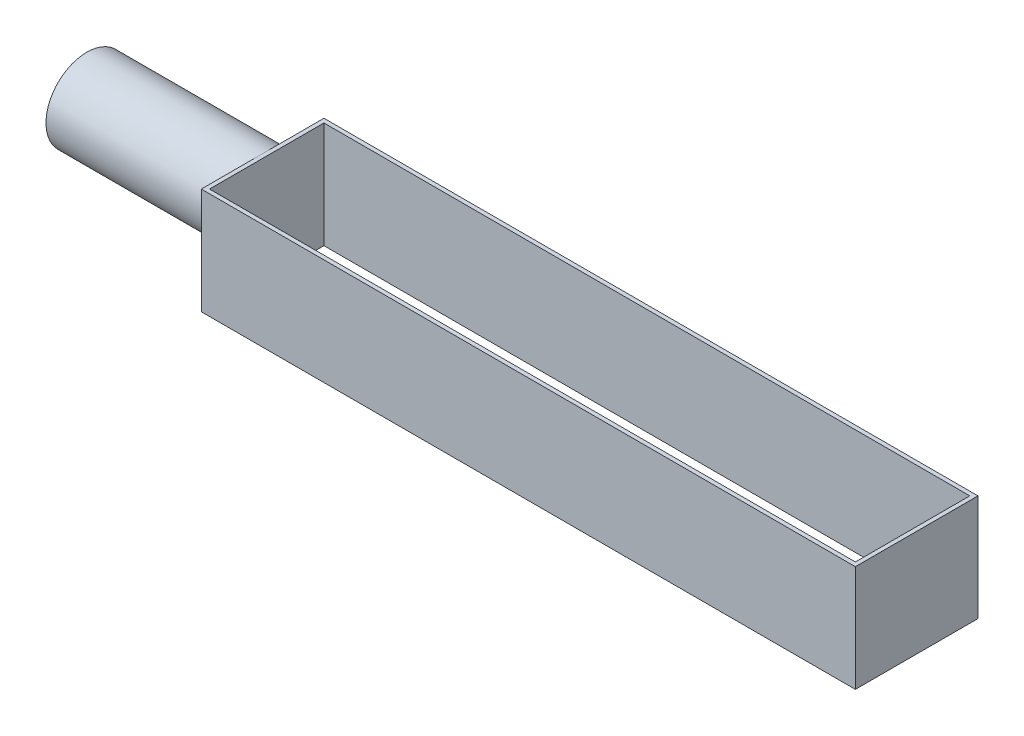
ISO-10303-21;
HEADER;
FILE_DESCRIPTION(('STEP AP214'),'2;1');
FILE_NAME('part.step','',(''),(''),'','','');
FILE_SCHEMA(('AUTOMOTIVE_DESIGN { 1 0 10303 214 1 1 1 1 }'));
ENDSEC;
DATA;
#1=APPLICATION_CONTEXT('core data for automotive mechanical design processes');
#2=APPLICATION_PROTOCOL_DEFINITION('international standard','automotive_design',2000,#1);
#3=PRODUCT_CONTEXT('',#1,'mechanical');
#4=PRODUCT('Part','Part','',(#3));
#5=PRODUCT_RELATED_PRODUCT_CATEGORY('part','',(#4));
#6=PRODUCT_DEFINITION_FORMATION('','',#4);
#7=PRODUCT_DEFINITION_CONTEXT('part definition',#1,'design');
#8=PRODUCT_DEFINITION('design','',#6,#7);
#9=PRODUCT_DEFINITION_SHAPE('','',#8);
#10=(LENGTH_UNIT() NAMED_UNIT(*) SI_UNIT(.MILLI.,.METRE.));
#11=(NAMED_UNIT(*) PLANE_ANGLE_UNIT() SI_UNIT($,.RADIAN.));
#12=(NAMED_UNIT(*) SI_UNIT($,.STERADIAN.) SOLID_ANGLE_UNIT());
#13=UNCERTAINTY_MEASURE_WITH_UNIT(LENGTH_MEASURE(1.E-05),#10,'distance_accuracy_value','');
#14=(GEOMETRIC_REPRESENTATION_CONTEXT(3) GLOBAL_UNCERTAINTY_ASSIGNED_CONTEXT((#13)) GLOBAL_UNIT_ASSIGNED_CONTEXT((#10,
#11,#12)) REPRESENTATION_CONTEXT('',''));
#15=CARTESIAN_POINT('',(0.,0.,0.));
#16=DIRECTION('',(0.,0.,1.));
#17=DIRECTION('',(1.,0.,0.));
#18=AXIS2_PLACEMENT_3D('',#15,#16,#17);
#19=CARTESIAN_POINT('',(22.,0.,0.));
#20=DIRECTION('',(-1.,0.,0.));
#21=DIRECTION('',(0.,0.,1.));
#22=AXIS2_PLACEMENT_3D('',#19,#20,#21);
#23=CYLINDRICAL_SURFACE('',#22,5.);
#24=CARTESIAN_POINT('',(21.5,0.,0.));
#25=DIRECTION('',(-1.,0.,0.));
#26=DIRECTION('',(0.,0.,1.));
#27=AXIS2_PLACEMENT_3D('',#24,#25,#26);
#28=CIRCLE('',#27,5.);
#29=CARTESIAN_POINT('',(21.5,5.,0.));
#30=VERTEX_POINT('',#29);
#31=EDGE_CURVE('E11',#30,#30,#28,.T.);
#32=ORIENTED_EDGE('',*,*,#31,.T.);
#33=EDGE_LOOP('',(#32));
#34=FACE_BOUND('',#33,.T.);
#35=CARTESIAN_POINT('',(0.,0.,0.));
#36=DIRECTION('',(1.,0.,0.));
#37=DIRECTION('',(0.,0.,-1.));
#38=AXIS2_PLACEMENT_3D('',#35,#36,#37);
#39=CIRCLE('',#38,5.);
#40=CARTESIAN_POINT('',(0.,0.,-5.));
#41=VERTEX_POINT('',#40);
#42=EDGE_CURVE('E53',#41,#41,#39,.T.);
#43=ORIENTED_EDGE('',*,*,#42,.T.);
#44=EDGE_LOOP('',(#43));
#45=FACE_BOUND('',#44,.T.);
#46=ADVANCED_FACE('F45',(#34,#45),#23,.T.);
#47=CARTESIAN_POINT('',(0.,0.,0.));
#48=DIRECTION('',(1.,0.,0.));
#49=DIRECTION('',(0.,0.,-1.));
#50=AXIS2_PLACEMENT_3D('',#47,#48,#49);
#51=PLANE('',#50);
#52=ORIENTED_EDGE('',*,*,#42,.F.);
#53=EDGE_LOOP('',(#52));
#54=FACE_BOUND('',#53,.T.);
#55=ADVANCED_FACE('F213',(#54),#51,.F.);
#56=CARTESIAN_POINT('',(21.5,-8.,7.5));
#57=DIRECTION('',(-1.,0.,0.));
#58=DIRECTION('',(0.,0.,1.));
#59=AXIS2_PLACEMENT_3D('',#56,#57,#58);
#60=PLANE('',#59);
#61=DIRECTION('',(0.,0.,1.));
#62=VECTOR('',#61,1.);
#63=CARTESIAN_POINT('',(21.5,5.,7.5));
#64=LINE('',#63,#62);
#65=CARTESIAN_POINT('',(21.5,5.,7.5));
#66=VERTEX_POINT('',#65);
#67=EDGE_CURVE('E149',#30,#66,#64,.T.);
#68=ORIENTED_EDGE('',*,*,#67,.F.);
#69=ORIENTED_EDGE('',*,*,#31,.F.);
#70=CARTESIAN_POINT('',(21.5,5.,-7.5));
#71=VERTEX_POINT('',#70);
#72=EDGE_CURVE('E60',#71,#30,#64,.T.);
#73=ORIENTED_EDGE('',*,*,#72,.F.);
#74=DIRECTION('',(0.,1.,0.));
#75=VECTOR('',#74,1.);
#76=CARTESIAN_POINT('',(21.5,-8.,-7.5));
#77=LINE('',#76,#75);
#78=CARTESIAN_POINT('',(21.5,-8.,-7.5));
#79=VERTEX_POINT('',#78);
#80=EDGE_CURVE('E197',#79,#71,#77,.T.);
#81=ORIENTED_EDGE('',*,*,#80,.F.);
#82=DIRECTION('',(0.,0.,1.));
#83=VECTOR('',#82,1.);
#84=CARTESIAN_POINT('',(21.5,-8.,7.5));
#85=LINE('',#84,#83);
#86=CARTESIAN_POINT('',(21.5,-8.,7.5));
#87=VERTEX_POINT('',#86);
#88=EDGE_CURVE('E175',#79,#87,#85,.T.);
#89=ORIENTED_EDGE('',*,*,#88,.T.);
#90=DIRECTION('',(0.,1.,0.));
#91=VECTOR('',#90,1.);
#92=CARTESIAN_POINT('',(21.5,-8.,7.5));
#93=LINE('',#92,#91);
#94=EDGE_CURVE('E196',#87,#66,#93,.T.);
#95=ORIENTED_EDGE('',*,*,#94,.T.);
#96=EDGE_LOOP('',(#68,#69,#73,#81,#89,#95));
#97=FACE_BOUND('',#96,.T.);
#98=ADVANCED_FACE('F215',(#97),#60,.T.);
#99=CARTESIAN_POINT('',(101.5,-8.,-7.5));
#100=DIRECTION('',(0.,0.,-1.));
#101=DIRECTION('',(-1.,0.,0.));
#102=AXIS2_PLACEMENT_3D('',#99,#100,#101);
#103=PLANE('',#102);
#104=ORIENTED_EDGE('',*,*,#80,.T.);
#105=DIRECTION('',(-1.,0.,0.));
#106=VECTOR('',#105,1.);
#107=CARTESIAN_POINT('',(101.5,5.,-7.5));
#108=LINE('',#107,#106);
#109=CARTESIAN_POINT('',(101.5,5.,-7.5));
#110=VERTEX_POINT('',#109);
#111=EDGE_CURVE('E160',#110,#71,#108,.T.);
#112=ORIENTED_EDGE('',*,*,#111,.F.);
#113=DIRECTION('',(0.,1.,0.));
#114=VECTOR('',#113,1.);
#115=CARTESIAN_POINT('',(101.5,-8.,-7.5));
#116=LINE('',#115,#114);
#117=CARTESIAN_POINT('',(101.5,-8.,-7.5));
#118=VERTEX_POINT('',#117);
#119=EDGE_CURVE('E200',#118,#110,#116,.T.);
#120=ORIENTED_EDGE('',*,*,#119,.F.);
#121=DIRECTION('',(-1.,0.,0.));
#122=VECTOR('',#121,1.);
#123=CARTESIAN_POINT('',(101.5,-8.,-7.5));
#124=LINE('',#123,#122);
#125=EDGE_CURVE('E192',#118,#79,#124,.T.);
#126=ORIENTED_EDGE('',*,*,#125,.T.);
#127=EDGE_LOOP('',(#104,#112,#120,#126));
#128=FACE_BOUND('',#127,.T.);
#129=ADVANCED_FACE('F220',(#128),#103,.T.);
#130=CARTESIAN_POINT('',(101.5,-8.,7.5));
#131=DIRECTION('',(1.,0.,0.));
#132=DIRECTION('',(0.,0.,-1.));
#133=AXIS2_PLACEMENT_3D('',#130,#131,#132);
#134=PLANE('',#133);
#135=ORIENTED_EDGE('',*,*,#119,.T.);
#136=DIRECTION('',(0.,0.,-1.));
#137=VECTOR('',#136,1.);
#138=CARTESIAN_POINT('',(101.5,5.,7.5));
#139=LINE('',#138,#137);
#140=CARTESIAN_POINT('',(101.5,5.,7.5));
#141=VERTEX_POINT('',#140);
#142=EDGE_CURVE('E156',#141,#110,#139,.T.);
#143=ORIENTED_EDGE('',*,*,#142,.F.);
#144=DIRECTION('',(0.,1.,0.));
#145=VECTOR('',#144,1.);
#146=CARTESIAN_POINT('',(101.5,-8.,7.5));
#147=LINE('',#146,#145);
#148=CARTESIAN_POINT('',(101.5,-8.,7.5));
#149=VERTEX_POINT('',#148);
#150=EDGE_CURVE('E203',#149,#141,#147,.T.);
#151=ORIENTED_EDGE('',*,*,#150,.F.);
#152=DIRECTION('',(0.,0.,-1.));
#153=VECTOR('',#152,1.);
#154=CARTESIAN_POINT('',(101.5,-8.,7.5));
#155=LINE('',#154,#153);
#156=EDGE_CURVE('E188',#149,#118,#155,.T.);
#157=ORIENTED_EDGE('',*,*,#156,.T.);
#158=EDGE_LOOP('',(#135,#143,#151,#157));
#159=FACE_BOUND('',#158,.T.);
#160=ADVANCED_FACE('F231',(#159),#134,.T.);
#161=CARTESIAN_POINT('',(101.5,-8.,7.5));
#162=DIRECTION('',(0.,0.,1.));
#163=DIRECTION('',(1.,0.,0.));
#164=AXIS2_PLACEMENT_3D('',#161,#162,#163);
#165=PLANE('',#164);
#166=ORIENTED_EDGE('',*,*,#150,.T.);
#167=DIRECTION('',(1.,0.,0.));
#168=VECTOR('',#167,1.);
#169=CARTESIAN_POINT('',(101.5,5.,7.5));
#170=LINE('',#169,#168);
#171=EDGE_CURVE('E152',#66,#141,#170,.T.);
#172=ORIENTED_EDGE('',*,*,#171,.F.);
#173=ORIENTED_EDGE('',*,*,#94,.F.);
#174=DIRECTION('',(1.,0.,0.));
#175=VECTOR('',#174,1.);
#176=CARTESIAN_POINT('',(101.5,-8.,7.5));
#177=LINE('',#176,#175);
#178=EDGE_CURVE('E184',#87,#149,#177,.T.);
#179=ORIENTED_EDGE('',*,*,#178,.T.);
#180=EDGE_LOOP('',(#166,#172,#173,#179));
#181=FACE_BOUND('',#180,.T.);
#182=ADVANCED_FACE('F227',(#181),#165,.T.);
#183=CARTESIAN_POINT('',(0.,-8.,0.));
#184=DIRECTION('',(0.,1.,0.));
#185=DIRECTION('',(0.,0.,1.));
#186=AXIS2_PLACEMENT_3D('',#183,#184,#185);
#187=PLANE('',#186);
#188=DIRECTION('',(-1.,0.,0.));
#189=VECTOR('',#188,1.);
#190=CARTESIAN_POINT('',(101.,-8.,-7.));
#191=LINE('',#190,#189);
#192=CARTESIAN_POINT('',(101.,-8.,-7.));
#193=VERTEX_POINT('',#192);
#194=CARTESIAN_POINT('',(22.,-8.,-7.));
#195=VERTEX_POINT('',#194);
#196=EDGE_CURVE('E136',#193,#195,#191,.T.);
#197=ORIENTED_EDGE('',*,*,#196,.T.);
#198=DIRECTION('',(0.,0.,1.));
#199=VECTOR('',#198,1.);
#200=CARTESIAN_POINT('',(22.,-8.,7.));
#201=LINE('',#200,#199);
#202=CARTESIAN_POINT('',(22.,-8.,7.));
#203=VERTEX_POINT('',#202);
#204=EDGE_CURVE('E163',#195,#203,#201,.T.);
#205=ORIENTED_EDGE('',*,*,#204,.T.);
#206=DIRECTION('',(1.,0.,0.));
#207=VECTOR('',#206,1.);
#208=CARTESIAN_POINT('',(101.,-8.,7.));
#209=LINE('',#208,#207);
#210=CARTESIAN_POINT('',(101.,-8.,7.));
#211=VERTEX_POINT('',#210);
#212=EDGE_CURVE('E132',#203,#211,#209,.T.);
#213=ORIENTED_EDGE('',*,*,#212,.T.);
#214=DIRECTION('',(0.,0.,-1.));
#215=VECTOR('',#214,1.);
#216=CARTESIAN_POINT('',(101.,-8.,7.));
#217=LINE('',#216,#215);
#218=EDGE_CURVE('E68',#211,#193,#217,.T.);
#219=ORIENTED_EDGE('',*,*,#218,.T.);
#220=EDGE_LOOP('',(#197,#205,#213,#219));
#221=FACE_BOUND('',#220,.T.);
#222=ORIENTED_EDGE('',*,*,#88,.F.);
#223=ORIENTED_EDGE('',*,*,#125,.F.);
#224=ORIENTED_EDGE('',*,*,#156,.F.);
#225=ORIENTED_EDGE('',*,*,#178,.F.);
#226=EDGE_LOOP('',(#222,#223,#224,#225));
#227=FACE_BOUND('',#226,.T.);
#228=ADVANCED_FACE('F230',(#221,#227),#187,.F.);
#229=CARTESIAN_POINT('',(101.,-8.,-7.));
#230=DIRECTION('',(0.,0.,-1.));
#231=DIRECTION('',(-1.,0.,0.));
#232=AXIS2_PLACEMENT_3D('',#229,#230,#231);
#233=PLANE('',#232);
#234=DIRECTION('',(0.,1.,0.));
#235=VECTOR('',#234,1.);
#236=CARTESIAN_POINT('',(101.,-8.,-7.));
#237=LINE('',#236,#235);
#238=CARTESIAN_POINT('',(101.,5.,-7.));
#239=VERTEX_POINT('',#238);
#240=EDGE_CURVE('E176',#193,#239,#237,.T.);
#241=ORIENTED_EDGE('',*,*,#240,.T.);
#242=DIRECTION('',(-1.,0.,0.));
#243=VECTOR('',#242,1.);
#244=CARTESIAN_POINT('',(101.,5.,-7.));
#245=LINE('',#244,#243);
#246=CARTESIAN_POINT('',(22.,5.,-7.));
#247=VERTEX_POINT('',#246);
#248=EDGE_CURVE('E144',#239,#247,#245,.T.);
#249=ORIENTED_EDGE('',*,*,#248,.T.);
#250=DIRECTION('',(0.,1.,0.));
#251=VECTOR('',#250,1.);
#252=CARTESIAN_POINT('',(22.,-8.,-7.));
#253=LINE('',#252,#251);
#254=EDGE_CURVE('E119',#195,#247,#253,.T.);
#255=ORIENTED_EDGE('',*,*,#254,.F.);
#256=ORIENTED_EDGE('',*,*,#196,.F.);
#257=EDGE_LOOP('',(#241,#249,#255,#256));
#258=FACE_BOUND('',#257,.T.);
#259=ADVANCED_FACE('F241',(#258),#233,.F.);
#260=CARTESIAN_POINT('',(101.,-8.,7.));
#261=DIRECTION('',(1.,0.,0.));
#262=DIRECTION('',(0.,0.,-1.));
#263=AXIS2_PLACEMENT_3D('',#260,#261,#262);
#264=PLANE('',#263);
#265=DIRECTION('',(0.,1.,0.));
#266=VECTOR('',#265,1.);
#267=CARTESIAN_POINT('',(101.,-8.,7.));
#268=LINE('',#267,#266);
#269=CARTESIAN_POINT('',(101.,5.,7.));
#270=VERTEX_POINT('',#269);
#271=EDGE_CURVE('E135',#211,#270,#268,.T.);
#272=ORIENTED_EDGE('',*,*,#271,.T.);
#273=DIRECTION('',(0.,0.,-1.));
#274=VECTOR('',#273,1.);
#275=CARTESIAN_POINT('',(101.,5.,7.));
#276=LINE('',#275,#274);
#277=EDGE_CURVE('E140',#270,#239,#276,.T.);
#278=ORIENTED_EDGE('',*,*,#277,.T.);
#279=ORIENTED_EDGE('',*,*,#240,.F.);
#280=ORIENTED_EDGE('',*,*,#218,.F.);
#281=EDGE_LOOP('',(#272,#278,#279,#280));
#282=FACE_BOUND('',#281,.T.);
#283=ADVANCED_FACE('F245',(#282),#264,.F.);
#284=CARTESIAN_POINT('',(101.,-8.,7.));
#285=DIRECTION('',(0.,0.,1.));
#286=DIRECTION('',(1.,0.,0.));
#287=AXIS2_PLACEMENT_3D('',#284,#285,#286);
#288=PLANE('',#287);
#289=DIRECTION('',(0.,1.,0.));
#290=VECTOR('',#289,1.);
#291=CARTESIAN_POINT('',(22.,-8.,7.));
#292=LINE('',#291,#290);
#293=CARTESIAN_POINT('',(22.,5.,7.));
#294=VERTEX_POINT('',#293);
#295=EDGE_CURVE('E117',#203,#294,#292,.T.);
#296=ORIENTED_EDGE('',*,*,#295,.T.);
#297=DIRECTION('',(1.,0.,0.));
#298=VECTOR('',#297,1.);
#299=CARTESIAN_POINT('',(101.,5.,7.));
#300=LINE('',#299,#298);
#301=EDGE_CURVE('E125',#294,#270,#300,.T.);
#302=ORIENTED_EDGE('',*,*,#301,.T.);
#303=ORIENTED_EDGE('',*,*,#271,.F.);
#304=ORIENTED_EDGE('',*,*,#212,.F.);
#305=EDGE_LOOP('',(#296,#302,#303,#304));
#306=FACE_BOUND('',#305,.T.);
#307=ADVANCED_FACE('F129',(#306),#288,.F.);
#308=CARTESIAN_POINT('',(0.,5.,0.));
#309=DIRECTION('',(0.,1.,0.));
#310=DIRECTION('',(0.,0.,1.));
#311=AXIS2_PLACEMENT_3D('',#308,#309,#310);
#312=PLANE('',#311);
#313=ORIENTED_EDGE('',*,*,#72,.T.);
#314=ORIENTED_EDGE('',*,*,#67,.T.);
#315=ORIENTED_EDGE('',*,*,#171,.T.);
#316=ORIENTED_EDGE('',*,*,#142,.T.);
#317=ORIENTED_EDGE('',*,*,#111,.T.);
#318=EDGE_LOOP('',(#313,#314,#315,#316,#317));
#319=FACE_BOUND('',#318,.T.);
#320=ORIENTED_EDGE('',*,*,#301,.F.);
#321=DIRECTION('',(0.,0.,1.));
#322=VECTOR('',#321,1.);
#323=CARTESIAN_POINT('',(22.,5.,7.));
#324=LINE('',#323,#322);
#325=EDGE_CURVE('E113',#247,#294,#324,.T.);
#326=ORIENTED_EDGE('',*,*,#325,.F.);
#327=ORIENTED_EDGE('',*,*,#248,.F.);
#328=ORIENTED_EDGE('',*,*,#277,.F.);
#329=EDGE_LOOP('',(#320,#326,#327,#328));
#330=FACE_BOUND('',#329,.T.);
#331=ADVANCED_FACE('F138',(#319,#330),#312,.T.);
#332=CARTESIAN_POINT('',(22.,0.,0.));
#333=DIRECTION('',(1.,0.,0.));
#334=DIRECTION('',(0.,0.,-1.));
#335=AXIS2_PLACEMENT_3D('',#332,#333,#334);
#336=PLANE('',#335);
#337=ORIENTED_EDGE('',*,*,#325,.T.);
#338=ORIENTED_EDGE('',*,*,#295,.F.);
#339=ORIENTED_EDGE('',*,*,#204,.F.);
#340=ORIENTED_EDGE('',*,*,#254,.T.);
#341=EDGE_LOOP('',(#337,#338,#339,#340));
#342=FACE_BOUND('',#341,.T.);
#343=ADVANCED_FACE('F115',(#342),#336,.T.);
#344=CLOSED_SHELL('',(#46,#55,#98,#129,#160,#182,#228,#259,#283,#307,#331,#343));
#345=MANIFOLD_SOLID_BREP('B2',#344);
#346=ADVANCED_BREP_SHAPE_REPRESENTATION('',(#18,#345),#14);
#347=SHAPE_DEFINITION_REPRESENTATION(#9,#346);
ENDSEC;
END-ISO-10303-21;
